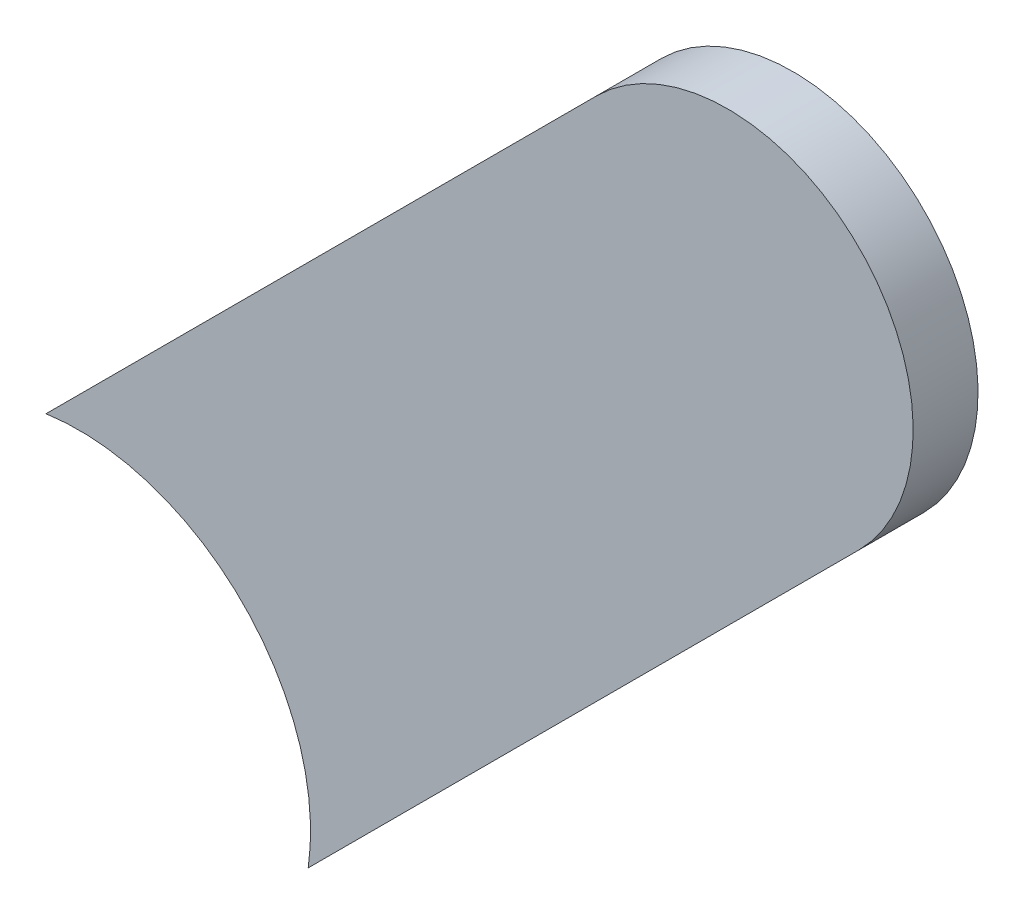
ISO-10303-21;
HEADER;
FILE_DESCRIPTION(('STEP AP214'),'2;1');
FILE_NAME('part.step','',(''),(''),'','','');
FILE_SCHEMA(('AUTOMOTIVE_DESIGN { 1 0 10303 214 1 1 1 1 }'));
ENDSEC;
DATA;
#1=APPLICATION_CONTEXT('core data for automotive mechanical design processes');
#2=APPLICATION_PROTOCOL_DEFINITION('international standard','automotive_design',2000,#1);
#3=PRODUCT_CONTEXT('',#1,'mechanical');
#4=PRODUCT('Part','Part','',(#3));
#5=PRODUCT_RELATED_PRODUCT_CATEGORY('part','',(#4));
#6=PRODUCT_DEFINITION_FORMATION('','',#4);
#7=PRODUCT_DEFINITION_CONTEXT('part definition',#1,'design');
#8=PRODUCT_DEFINITION('design','',#6,#7);
#9=PRODUCT_DEFINITION_SHAPE('','',#8);
#10=(LENGTH_UNIT() NAMED_UNIT(*) SI_UNIT(.MILLI.,.METRE.));
#11=(NAMED_UNIT(*) PLANE_ANGLE_UNIT() SI_UNIT($,.RADIAN.));
#12=(NAMED_UNIT(*) SI_UNIT($,.STERADIAN.) SOLID_ANGLE_UNIT());
#13=UNCERTAINTY_MEASURE_WITH_UNIT(LENGTH_MEASURE(1.E-05),#10,'distance_accuracy_value','');
#14=(GEOMETRIC_REPRESENTATION_CONTEXT(3) GLOBAL_UNCERTAINTY_ASSIGNED_CONTEXT((#13)) GLOBAL_UNIT_ASSIGNED_CONTEXT((#10,
#11,#12)) REPRESENTATION_CONTEXT('',''));
#15=CARTESIAN_POINT('',(0.,0.,0.));
#16=DIRECTION('',(0.,0.,1.));
#17=DIRECTION('',(1.,0.,0.));
#18=AXIS2_PLACEMENT_3D('',#15,#16,#17);
#19=CARTESIAN_POINT('',(81.699289,-102.989289,1.6));
#20=DIRECTION('',(0.707106781186548,-0.707106781186548,0.));
#21=DIRECTION('',(0.,0.,-1.));
#22=AXIS2_PLACEMENT_3D('',#19,#20,#21);
#23=PLANE('',#22);
#24=DIRECTION('',(0.,0.,-1.));
#25=VECTOR('',#24,1.);
#26=CARTESIAN_POINT('',(81.402321579411,-103.2862564205,-0.045));
#27=LINE('',#26,#25);
#28=CARTESIAN_POINT('',(81.402321579414,-103.2862564205,1.635));
#29=VERTEX_POINT('',#28);
#30=CARTESIAN_POINT('',(81.402321579414,-103.2862564205,1.6));
#31=VERTEX_POINT('',#30);
#32=EDGE_CURVE('E11',#29,#31,#27,.T.);
#33=ORIENTED_EDGE('',*,*,#32,.F.);
#34=DIRECTION('',(-0.707106781186548,-0.707106781186548,0.));
#35=VECTOR('',#34,1.);
#36=CARTESIAN_POINT('',(81.699289,-102.989289,1.635));
#37=LINE('',#36,#35);
#38=CARTESIAN_POINT('',(81.699289,-102.989289,1.635));
#39=VERTEX_POINT('',#38);
#40=EDGE_CURVE('E26',#39,#29,#37,.T.);
#41=ORIENTED_EDGE('',*,*,#40,.F.);
#42=DIRECTION('',(0.,0.,1.));
#43=VECTOR('',#42,1.);
#44=CARTESIAN_POINT('',(81.699289,-102.989289,1.6));
#45=LINE('',#44,#43);
#46=CARTESIAN_POINT('',(81.699289,-102.989289,1.6));
#47=VERTEX_POINT('',#46);
#48=EDGE_CURVE('E109',#47,#39,#45,.T.);
#49=ORIENTED_EDGE('',*,*,#48,.F.);
#50=DIRECTION('',(-0.707106781186548,-0.707106781186548,0.));
#51=VECTOR('',#50,1.);
#52=CARTESIAN_POINT('',(81.699289,-102.989289,1.6));
#53=LINE('',#52,#51);
#54=EDGE_CURVE('E71',#47,#31,#53,.T.);
#55=ORIENTED_EDGE('',*,*,#54,.T.);
#56=EDGE_LOOP('',(#33,#41,#49,#55));
#57=FACE_BOUND('',#56,.T.);
#58=ADVANCED_FACE('F17',(#57),#23,.F.);
#59=CARTESIAN_POINT('',(81.42,-103.41,-0.045));
#60=DIRECTION('',(0.,0.,-1.));
#61=DIRECTION('',(0.,-1.,0.));
#62=AXIS2_PLACEMENT_3D('',#59,#60,#61);
#63=CYLINDRICAL_SURFACE('',#62,0.125);
#64=DIRECTION('',(0.,0.,-1.));
#65=VECTOR('',#64,1.);
#66=CARTESIAN_POINT('',(81.543743912735,-103.4276760872,-0.045));
#67=LINE('',#66,#65);
#68=CARTESIAN_POINT('',(81.543743912733,-103.4276760872,1.635));
#69=VERTEX_POINT('',#68);
#70=CARTESIAN_POINT('',(81.543743912733,-103.4276760872,1.6));
#71=VERTEX_POINT('',#70);
#72=EDGE_CURVE('E84',#69,#71,#67,.T.);
#73=ORIENTED_EDGE('',*,*,#72,.F.);
#74=CARTESIAN_POINT('',(81.42,-103.41,1.635));
#75=DIRECTION('',(0.,0.,-1.));
#76=DIRECTION('',(0.,-1.,0.));
#77=AXIS2_PLACEMENT_3D('',#74,#75,#76);
#78=CIRCLE('',#77,0.125);
#79=EDGE_CURVE('E102',#29,#69,#78,.T.);
#80=ORIENTED_EDGE('',*,*,#79,.F.);
#81=ORIENTED_EDGE('',*,*,#32,.T.);
#82=CARTESIAN_POINT('',(81.42,-103.41,1.6));
#83=DIRECTION('',(0.,0.,-1.));
#84=DIRECTION('',(0.,-1.,0.));
#85=AXIS2_PLACEMENT_3D('',#82,#83,#84);
#86=CIRCLE('',#85,0.125);
#87=EDGE_CURVE('E76',#31,#71,#86,.T.);
#88=ORIENTED_EDGE('',*,*,#87,.T.);
#89=EDGE_LOOP('',(#73,#80,#81,#88));
#90=FACE_BOUND('',#89,.T.);
#91=ADVANCED_FACE('F120',(#90),#63,.F.);
#92=CARTESIAN_POINT('',(81.49071,-103.48071,1.635));
#93=DIRECTION('',(0.,0.,1.));
#94=DIRECTION('',(1.,0.,0.));
#95=AXIS2_PLACEMENT_3D('',#92,#93,#94);
#96=PLANE('',#95);
#97=ORIENTED_EDGE('',*,*,#79,.T.);
#98=DIRECTION('',(0.707106781186548,0.707106781186548,0.));
#99=VECTOR('',#98,1.);
#100=CARTESIAN_POINT('',(81.49071,-103.48071,1.635));
#101=LINE('',#100,#99);
#102=CARTESIAN_POINT('',(81.84071,-103.13071,1.635));
#103=VERTEX_POINT('',#102);
#104=EDGE_CURVE('E92',#69,#103,#101,.T.);
#105=ORIENTED_EDGE('',*,*,#104,.T.);
#106=CARTESIAN_POINT('',(81.7699995,-103.0599995,1.635));
#107=DIRECTION('',(0.,0.,1.));
#108=DIRECTION('',(0.707106781187047,-0.707106781186048,0.));
#109=AXIS2_PLACEMENT_3D('',#106,#107,#108);
#110=CIRCLE('',#109,0.09999974810219);
#111=EDGE_CURVE('E89',#103,#39,#110,.T.);
#112=ORIENTED_EDGE('',*,*,#111,.T.);
#113=ORIENTED_EDGE('',*,*,#40,.T.);
#114=EDGE_LOOP('',(#97,#105,#112,#113));
#115=FACE_BOUND('',#114,.T.);
#116=ADVANCED_FACE('F118',(#115),#96,.T.);
#117=CARTESIAN_POINT('',(81.7699995,-103.0599995,1.6));
#118=DIRECTION('',(0.,0.,-1.));
#119=DIRECTION('',(0.707106781187048,-0.707106781186048,0.));
#120=AXIS2_PLACEMENT_3D('',#117,#118,#119);
#121=CYLINDRICAL_SURFACE('',#120,0.09999974810219);
#122=CARTESIAN_POINT('',(81.7699995,-103.0599995,1.6));
#123=DIRECTION('',(0.,0.,1.));
#124=DIRECTION('',(0.707106781187047,-0.707106781186048,0.));
#125=AXIS2_PLACEMENT_3D('',#122,#123,#124);
#126=CIRCLE('',#125,0.09999974810219);
#127=CARTESIAN_POINT('',(81.84071,-103.13071,1.6));
#128=VERTEX_POINT('',#127);
#129=EDGE_CURVE('E65',#128,#47,#126,.T.);
#130=ORIENTED_EDGE('',*,*,#129,.T.);
#131=ORIENTED_EDGE('',*,*,#48,.T.);
#132=ORIENTED_EDGE('',*,*,#111,.F.);
#133=DIRECTION('',(0.,0.,1.));
#134=VECTOR('',#133,1.);
#135=CARTESIAN_POINT('',(81.84071,-103.13071,1.6));
#136=LINE('',#135,#134);
#137=EDGE_CURVE('E82',#128,#103,#136,.T.);
#138=ORIENTED_EDGE('',*,*,#137,.F.);
#139=EDGE_LOOP('',(#130,#131,#132,#138));
#140=FACE_BOUND('',#139,.T.);
#141=ADVANCED_FACE('F87',(#140),#121,.T.);
#142=CARTESIAN_POINT('',(81.49071,-103.48071,1.6));
#143=DIRECTION('',(0.,0.,1.));
#144=DIRECTION('',(1.,0.,0.));
#145=AXIS2_PLACEMENT_3D('',#142,#143,#144);
#146=PLANE('',#145);
#147=ORIENTED_EDGE('',*,*,#54,.F.);
#148=ORIENTED_EDGE('',*,*,#129,.F.);
#149=DIRECTION('',(0.707106781186548,0.707106781186548,0.));
#150=VECTOR('',#149,1.);
#151=CARTESIAN_POINT('',(81.49071,-103.48071,1.6));
#152=LINE('',#151,#150);
#153=EDGE_CURVE('E69',#71,#128,#152,.T.);
#154=ORIENTED_EDGE('',*,*,#153,.F.);
#155=ORIENTED_EDGE('',*,*,#87,.F.);
#156=EDGE_LOOP('',(#147,#148,#154,#155));
#157=FACE_BOUND('',#156,.T.);
#158=ADVANCED_FACE('F67',(#157),#146,.F.);
#159=CARTESIAN_POINT('',(81.49071,-103.48071,1.6));
#160=DIRECTION('',(-0.707106781186548,0.707106781186548,0.));
#161=DIRECTION('',(0.,0.,1.));
#162=AXIS2_PLACEMENT_3D('',#159,#160,#161);
#163=PLANE('',#162);
#164=ORIENTED_EDGE('',*,*,#137,.T.);
#165=ORIENTED_EDGE('',*,*,#104,.F.);
#166=ORIENTED_EDGE('',*,*,#72,.T.);
#167=ORIENTED_EDGE('',*,*,#153,.T.);
#168=EDGE_LOOP('',(#164,#165,#166,#167));
#169=FACE_BOUND('',#168,.T.);
#170=ADVANCED_FACE('F80',(#169),#163,.F.);
#171=CLOSED_SHELL('',(#58,#91,#116,#141,#158,#170));
#172=MANIFOLD_SOLID_BREP('B1',#171);
#173=ADVANCED_BREP_SHAPE_REPRESENTATION('',(#18,#172),#14);
#174=SHAPE_DEFINITION_REPRESENTATION(#9,#173);
ENDSEC;
END-ISO-10303-21;
